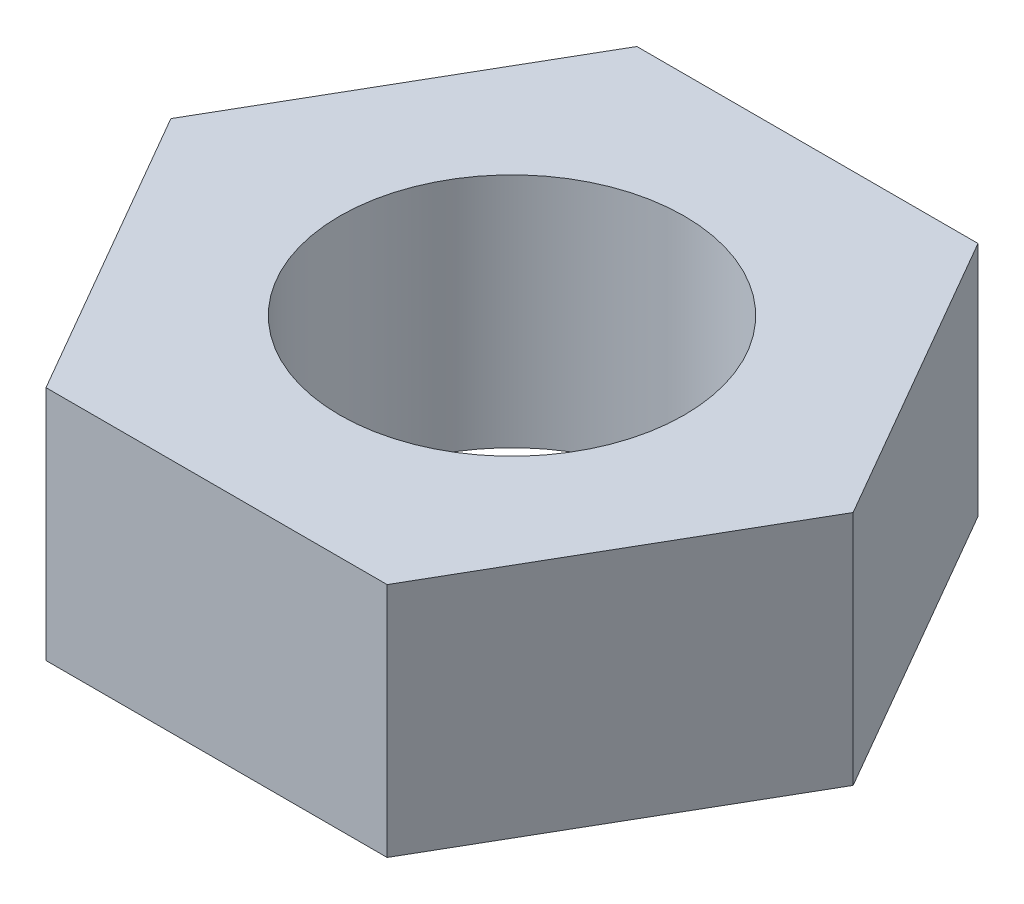
ISO-10303-21;
HEADER;
FILE_DESCRIPTION(('STEP AP214'),'2;1');
FILE_NAME('part.step','',(''),(''),'','','');
FILE_SCHEMA(('AUTOMOTIVE_DESIGN { 1 0 10303 214 1 1 1 1 }'));
ENDSEC;
DATA;
#1=APPLICATION_CONTEXT('core data for automotive mechanical design processes');
#2=APPLICATION_PROTOCOL_DEFINITION('international standard','automotive_design',2000,#1);
#3=PRODUCT_CONTEXT('',#1,'mechanical');
#4=PRODUCT('Part','Part','',(#3));
#5=PRODUCT_RELATED_PRODUCT_CATEGORY('part','',(#4));
#6=PRODUCT_DEFINITION_FORMATION('','',#4);
#7=PRODUCT_DEFINITION_CONTEXT('part definition',#1,'design');
#8=PRODUCT_DEFINITION('design','',#6,#7);
#9=PRODUCT_DEFINITION_SHAPE('','',#8);
#10=(LENGTH_UNIT() NAMED_UNIT(*) SI_UNIT(.MILLI.,.METRE.));
#11=(NAMED_UNIT(*) PLANE_ANGLE_UNIT() SI_UNIT($,.RADIAN.));
#12=(NAMED_UNIT(*) SI_UNIT($,.STERADIAN.) SOLID_ANGLE_UNIT());
#13=UNCERTAINTY_MEASURE_WITH_UNIT(LENGTH_MEASURE(1.E-05),#10,'distance_accuracy_value','');
#14=(GEOMETRIC_REPRESENTATION_CONTEXT(3) GLOBAL_UNCERTAINTY_ASSIGNED_CONTEXT((#13)) GLOBAL_UNIT_ASSIGNED_CONTEXT((#10,
#11,#12)) REPRESENTATION_CONTEXT('',''));
#15=CARTESIAN_POINT('',(0.,0.,0.));
#16=DIRECTION('',(0.,0.,1.));
#17=DIRECTION('',(1.,0.,0.));
#18=AXIS2_PLACEMENT_3D('',#15,#16,#17);
#19=CARTESIAN_POINT('',(-5.4992613140313,7.62,-9.52499999999994));
#20=DIRECTION('',(0.866025403784442,0.,0.499999999999995));
#21=DIRECTION('',(0.499999999999995,0.,-0.866025403784442));
#22=AXIS2_PLACEMENT_3D('',#19,#20,#21);
#23=PLANE('',#22);
#24=DIRECTION('',(-0.499999999999995,0.,0.866025403784441));
#25=VECTOR('',#24,1.);
#26=CARTESIAN_POINT('',(-5.4992613140313,0.,-9.52499999999994));
#27=LINE('',#26,#25);
#28=CARTESIAN_POINT('',(-5.4992613140313,0.,-9.52499999999994));
#29=VERTEX_POINT('',#28);
#30=CARTESIAN_POINT('',(-10.9985226280624,0.,0.));
#31=VERTEX_POINT('',#30);
#32=EDGE_CURVE('E118',#29,#31,#27,.T.);
#33=ORIENTED_EDGE('',*,*,#32,.T.);
#34=DIRECTION('',(0.,-1.,0.));
#35=VECTOR('',#34,1.);
#36=CARTESIAN_POINT('',(-10.9985226280624,7.62,0.));
#37=LINE('',#36,#35);
#38=CARTESIAN_POINT('',(-10.9985226280624,7.62,0.));
#39=VERTEX_POINT('',#38);
#40=EDGE_CURVE('E11',#39,#31,#37,.T.);
#41=ORIENTED_EDGE('',*,*,#40,.F.);
#42=DIRECTION('',(-0.499999999999995,0.,0.866025403784441));
#43=VECTOR('',#42,1.);
#44=CARTESIAN_POINT('',(-5.4992613140313,7.62,-9.52499999999994));
#45=LINE('',#44,#43);
#46=CARTESIAN_POINT('',(-5.4992613140313,7.62,-9.52499999999994));
#47=VERTEX_POINT('',#46);
#48=EDGE_CURVE('E129',#47,#39,#45,.T.);
#49=ORIENTED_EDGE('',*,*,#48,.F.);
#50=DIRECTION('',(0.,-1.,0.));
#51=VECTOR('',#50,1.);
#52=CARTESIAN_POINT('',(-5.4992613140313,7.62,-9.52499999999994));
#53=LINE('',#52,#51);
#54=EDGE_CURVE('E114',#47,#29,#53,.T.);
#55=ORIENTED_EDGE('',*,*,#54,.T.);
#56=EDGE_LOOP('',(#33,#41,#49,#55));
#57=FACE_BOUND('',#56,.T.);
#58=ADVANCED_FACE('F34',(#57),#23,.F.);
#59=CARTESIAN_POINT('',(-10.9985226280624,7.62,0.));
#60=DIRECTION('',(0.866025403784438,0.,-0.500000000000001));
#61=DIRECTION('',(-0.500000000000001,0.,-0.866025403784438));
#62=AXIS2_PLACEMENT_3D('',#59,#60,#61);
#63=PLANE('',#62);
#64=DIRECTION('',(0.500000000000001,0.,0.866025403784438));
#65=VECTOR('',#64,1.);
#66=CARTESIAN_POINT('',(-10.9985226280624,0.,0.));
#67=LINE('',#66,#65);
#68=CARTESIAN_POINT('',(-5.49926131403117,0.,9.52500000000002));
#69=VERTEX_POINT('',#68);
#70=EDGE_CURVE('E121',#31,#69,#67,.T.);
#71=ORIENTED_EDGE('',*,*,#70,.T.);
#72=DIRECTION('',(0.,-1.,0.));
#73=VECTOR('',#72,1.);
#74=CARTESIAN_POINT('',(-5.49926131403117,7.62,9.52500000000002));
#75=LINE('',#74,#73);
#76=CARTESIAN_POINT('',(-5.49926131403117,7.62,9.52500000000002));
#77=VERTEX_POINT('',#76);
#78=EDGE_CURVE('E42',#77,#69,#75,.T.);
#79=ORIENTED_EDGE('',*,*,#78,.F.);
#80=DIRECTION('',(0.500000000000001,0.,0.866025403784438));
#81=VECTOR('',#80,1.);
#82=CARTESIAN_POINT('',(-10.9985226280624,7.62,0.));
#83=LINE('',#82,#81);
#84=EDGE_CURVE('E87',#39,#77,#83,.T.);
#85=ORIENTED_EDGE('',*,*,#84,.F.);
#86=ORIENTED_EDGE('',*,*,#40,.T.);
#87=EDGE_LOOP('',(#71,#79,#85,#86));
#88=FACE_BOUND('',#87,.T.);
#89=ADVANCED_FACE('F154',(#88),#63,.F.);
#90=CARTESIAN_POINT('',(-5.49926131403117,7.62,9.52500000000002));
#91=DIRECTION('',(0.,0.,-1.));
#92=DIRECTION('',(-1.,0.,0.));
#93=AXIS2_PLACEMENT_3D('',#90,#91,#92);
#94=PLANE('',#93);
#95=DIRECTION('',(1.,0.,0.));
#96=VECTOR('',#95,1.);
#97=CARTESIAN_POINT('',(-5.49926131403117,0.,9.52500000000002));
#98=LINE('',#97,#96);
#99=CARTESIAN_POINT('',(5.49926131403124,0.,9.52499999999998));
#100=VERTEX_POINT('',#99);
#101=EDGE_CURVE('E124',#69,#100,#98,.T.);
#102=ORIENTED_EDGE('',*,*,#101,.T.);
#103=DIRECTION('',(0.,-1.,0.));
#104=VECTOR('',#103,1.);
#105=CARTESIAN_POINT('',(5.49926131403124,7.62,9.52499999999998));
#106=LINE('',#105,#104);
#107=CARTESIAN_POINT('',(5.49926131403124,7.62,9.52499999999998));
#108=VERTEX_POINT('',#107);
#109=EDGE_CURVE('E109',#108,#100,#106,.T.);
#110=ORIENTED_EDGE('',*,*,#109,.F.);
#111=DIRECTION('',(1.,0.,0.));
#112=VECTOR('',#111,1.);
#113=CARTESIAN_POINT('',(-5.49926131403117,7.62,9.52500000000002));
#114=LINE('',#113,#112);
#115=EDGE_CURVE('E100',#77,#108,#114,.T.);
#116=ORIENTED_EDGE('',*,*,#115,.F.);
#117=ORIENTED_EDGE('',*,*,#78,.T.);
#118=EDGE_LOOP('',(#102,#110,#116,#117));
#119=FACE_BOUND('',#118,.T.);
#120=ADVANCED_FACE('F135',(#119),#94,.F.);
#121=CARTESIAN_POINT('',(5.49926131403124,7.62,9.52499999999998));
#122=DIRECTION('',(-0.866025403784441,0.,-0.499999999999995));
#123=DIRECTION('',(-0.499999999999995,0.,0.866025403784442));
#124=AXIS2_PLACEMENT_3D('',#121,#122,#123);
#125=PLANE('',#124);
#126=DIRECTION('',(0.499999999999995,0.,-0.866025403784442));
#127=VECTOR('',#126,1.);
#128=CARTESIAN_POINT('',(5.49926131403124,0.,9.52499999999998));
#129=LINE('',#128,#127);
#130=CARTESIAN_POINT('',(10.9985226280624,0.,0.));
#131=VERTEX_POINT('',#130);
#132=EDGE_CURVE('E108',#100,#131,#129,.T.);
#133=ORIENTED_EDGE('',*,*,#132,.T.);
#134=DIRECTION('',(0.,-1.,0.));
#135=VECTOR('',#134,1.);
#136=CARTESIAN_POINT('',(10.9985226280624,7.62,0.));
#137=LINE('',#136,#135);
#138=CARTESIAN_POINT('',(10.9985226280624,7.62,0.));
#139=VERTEX_POINT('',#138);
#140=EDGE_CURVE('E105',#139,#131,#137,.T.);
#141=ORIENTED_EDGE('',*,*,#140,.F.);
#142=DIRECTION('',(0.499999999999995,0.,-0.866025403784442));
#143=VECTOR('',#142,1.);
#144=CARTESIAN_POINT('',(5.49926131403124,7.62,9.52499999999998));
#145=LINE('',#144,#143);
#146=EDGE_CURVE('E94',#108,#139,#145,.T.);
#147=ORIENTED_EDGE('',*,*,#146,.F.);
#148=ORIENTED_EDGE('',*,*,#109,.T.);
#149=EDGE_LOOP('',(#133,#141,#147,#148));
#150=FACE_BOUND('',#149,.T.);
#151=ADVANCED_FACE('F106',(#150),#125,.F.);
#152=CARTESIAN_POINT('',(10.9985226280624,7.62,0.));
#153=DIRECTION('',(-0.866025403784435,0.,0.500000000000007));
#154=DIRECTION('',(0.500000000000007,0.,0.866025403784435));
#155=AXIS2_PLACEMENT_3D('',#152,#153,#154);
#156=PLANE('',#155);
#157=DIRECTION('',(-0.500000000000007,0.,-0.866025403784435));
#158=VECTOR('',#157,1.);
#159=CARTESIAN_POINT('',(10.9985226280624,0.,0.));
#160=LINE('',#159,#158);
#161=CARTESIAN_POINT('',(5.4992613140311,0.,-9.52500000000006));
#162=VERTEX_POINT('',#161);
#163=EDGE_CURVE('E73',#131,#162,#160,.T.);
#164=ORIENTED_EDGE('',*,*,#163,.T.);
#165=DIRECTION('',(0.,-1.,0.));
#166=VECTOR('',#165,1.);
#167=CARTESIAN_POINT('',(5.4992613140311,7.62,-9.52500000000006));
#168=LINE('',#167,#166);
#169=CARTESIAN_POINT('',(5.4992613140311,7.62,-9.52500000000006));
#170=VERTEX_POINT('',#169);
#171=EDGE_CURVE('E110',#170,#162,#168,.T.);
#172=ORIENTED_EDGE('',*,*,#171,.F.);
#173=DIRECTION('',(-0.500000000000007,0.,-0.866025403784435));
#174=VECTOR('',#173,1.);
#175=CARTESIAN_POINT('',(10.9985226280624,7.62,0.));
#176=LINE('',#175,#174);
#177=EDGE_CURVE('E98',#139,#170,#176,.T.);
#178=ORIENTED_EDGE('',*,*,#177,.F.);
#179=ORIENTED_EDGE('',*,*,#140,.T.);
#180=EDGE_LOOP('',(#164,#172,#178,#179));
#181=FACE_BOUND('',#180,.T.);
#182=ADVANCED_FACE('F112',(#181),#156,.F.);
#183=CARTESIAN_POINT('',(5.4992613140311,7.62,-9.52500000000006));
#184=DIRECTION('',(0.,0.,1.));
#185=DIRECTION('',(1.,0.,0.));
#186=AXIS2_PLACEMENT_3D('',#183,#184,#185);
#187=PLANE('',#186);
#188=DIRECTION('',(-1.,0.,0.));
#189=VECTOR('',#188,1.);
#190=CARTESIAN_POINT('',(5.4992613140311,0.,-9.52500000000006));
#191=LINE('',#190,#189);
#192=EDGE_CURVE('E79',#162,#29,#191,.T.);
#193=ORIENTED_EDGE('',*,*,#192,.T.);
#194=ORIENTED_EDGE('',*,*,#54,.F.);
#195=DIRECTION('',(-1.,0.,0.));
#196=VECTOR('',#195,1.);
#197=CARTESIAN_POINT('',(5.4992613140311,7.62,-9.52500000000006));
#198=LINE('',#197,#196);
#199=EDGE_CURVE('E50',#170,#47,#198,.T.);
#200=ORIENTED_EDGE('',*,*,#199,.F.);
#201=ORIENTED_EDGE('',*,*,#171,.T.);
#202=EDGE_LOOP('',(#193,#194,#200,#201));
#203=FACE_BOUND('',#202,.T.);
#204=ADVANCED_FACE('F142',(#203),#187,.F.);
#205=CARTESIAN_POINT('',(0.,7.62,0.));
#206=DIRECTION('',(0.,1.,0.));
#207=DIRECTION('',(0.,0.,1.));
#208=AXIS2_PLACEMENT_3D('',#205,#206,#207);
#209=PLANE('',#208);
#210=CARTESIAN_POINT('',(0.,7.62,0.));
#211=DIRECTION('',(0.,1.,0.));
#212=DIRECTION('',(0.,0.,1.));
#213=AXIS2_PLACEMENT_3D('',#210,#211,#212);
#214=CIRCLE('',#213,5.55625);
#215=CARTESIAN_POINT('',(0.,7.62,5.55625));
#216=VERTEX_POINT('',#215);
#217=EDGE_CURVE('E209',#216,#216,#214,.T.);
#218=ORIENTED_EDGE('',*,*,#217,.F.);
#219=EDGE_LOOP('',(#218));
#220=FACE_BOUND('',#219,.T.);
#221=ORIENTED_EDGE('',*,*,#48,.T.);
#222=ORIENTED_EDGE('',*,*,#84,.T.);
#223=ORIENTED_EDGE('',*,*,#115,.T.);
#224=ORIENTED_EDGE('',*,*,#146,.T.);
#225=ORIENTED_EDGE('',*,*,#177,.T.);
#226=ORIENTED_EDGE('',*,*,#199,.T.);
#227=EDGE_LOOP('',(#221,#222,#223,#224,#225,#226));
#228=FACE_BOUND('',#227,.T.);
#229=ADVANCED_FACE('F96',(#220,#228),#209,.T.);
#230=CARTESIAN_POINT('',(0.,0.,0.));
#231=DIRECTION('',(0.,1.,0.));
#232=DIRECTION('',(0.,0.,1.));
#233=AXIS2_PLACEMENT_3D('',#230,#231,#232);
#234=PLANE('',#233);
#235=CARTESIAN_POINT('',(0.,0.,0.));
#236=DIRECTION('',(0.,1.,0.));
#237=DIRECTION('',(0.,0.,1.));
#238=AXIS2_PLACEMENT_3D('',#235,#236,#237);
#239=CIRCLE('',#238,5.55625);
#240=CARTESIAN_POINT('',(0.,0.,5.55625));
#241=VERTEX_POINT('',#240);
#242=EDGE_CURVE('E122',#241,#241,#239,.T.);
#243=ORIENTED_EDGE('',*,*,#242,.T.);
#244=EDGE_LOOP('',(#243));
#245=FACE_BOUND('',#244,.T.);
#246=ORIENTED_EDGE('',*,*,#32,.F.);
#247=ORIENTED_EDGE('',*,*,#192,.F.);
#248=ORIENTED_EDGE('',*,*,#163,.F.);
#249=ORIENTED_EDGE('',*,*,#132,.F.);
#250=ORIENTED_EDGE('',*,*,#101,.F.);
#251=ORIENTED_EDGE('',*,*,#70,.F.);
#252=EDGE_LOOP('',(#246,#247,#248,#249,#250,#251));
#253=FACE_BOUND('',#252,.T.);
#254=ADVANCED_FACE('F138',(#245,#253),#234,.F.);
#255=CARTESIAN_POINT('',(0.,7.62,0.));
#256=DIRECTION('',(0.,1.,0.));
#257=DIRECTION('',(0.,0.,1.));
#258=AXIS2_PLACEMENT_3D('',#255,#256,#257);
#259=CYLINDRICAL_SURFACE('',#258,5.55625);
#260=ORIENTED_EDGE('',*,*,#242,.F.);
#261=EDGE_LOOP('',(#260));
#262=FACE_BOUND('',#261,.T.);
#263=ORIENTED_EDGE('',*,*,#217,.T.);
#264=EDGE_LOOP('',(#263));
#265=FACE_BOUND('',#264,.T.);
#266=ADVANCED_FACE('F191',(#262,#265),#259,.F.);
#267=CLOSED_SHELL('',(#58,#89,#120,#151,#182,#204,#229,#254,#266));
#268=MANIFOLD_SOLID_BREP('B2',#267);
#269=ADVANCED_BREP_SHAPE_REPRESENTATION('',(#18,#268),#14);
#270=SHAPE_DEFINITION_REPRESENTATION(#9,#269);
ENDSEC;
END-ISO-10303-21;
